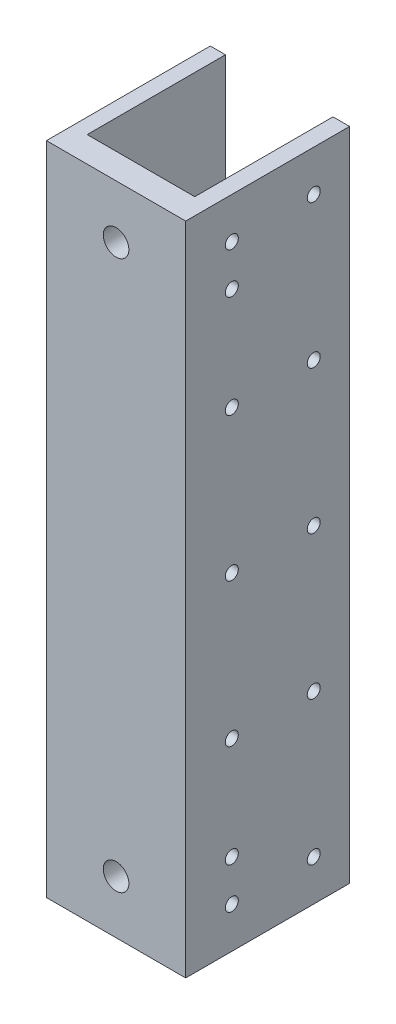
ISO-10303-21;
HEADER;
FILE_DESCRIPTION(('STEP AP214'),'2;1');
FILE_NAME('part.step','',(''),(''),'','','');
FILE_SCHEMA(('AUTOMOTIVE_DESIGN { 1 0 10303 214 1 1 1 1 }'));
ENDSEC;
DATA;
#1=APPLICATION_CONTEXT('core data for automotive mechanical design processes');
#2=APPLICATION_PROTOCOL_DEFINITION('international standard','automotive_design',2000,#1);
#3=PRODUCT_CONTEXT('',#1,'mechanical');
#4=PRODUCT('Part','Part','',(#3));
#5=PRODUCT_RELATED_PRODUCT_CATEGORY('part','',(#4));
#6=PRODUCT_DEFINITION_FORMATION('','',#4);
#7=PRODUCT_DEFINITION_CONTEXT('part definition',#1,'design');
#8=PRODUCT_DEFINITION('design','',#6,#7);
#9=PRODUCT_DEFINITION_SHAPE('','',#8);
#10=(LENGTH_UNIT() NAMED_UNIT(*) SI_UNIT(.MILLI.,.METRE.));
#11=(NAMED_UNIT(*) PLANE_ANGLE_UNIT() SI_UNIT($,.RADIAN.));
#12=(NAMED_UNIT(*) SI_UNIT($,.STERADIAN.) SOLID_ANGLE_UNIT());
#13=UNCERTAINTY_MEASURE_WITH_UNIT(LENGTH_MEASURE(1.E-05),#10,'distance_accuracy_value','');
#14=(GEOMETRIC_REPRESENTATION_CONTEXT(3) GLOBAL_UNCERTAINTY_ASSIGNED_CONTEXT((#13)) GLOBAL_UNIT_ASSIGNED_CONTEXT((#10,
#11,#12)) REPRESENTATION_CONTEXT('',''));
#15=CARTESIAN_POINT('',(0.,0.,0.));
#16=DIRECTION('',(0.,0.,1.));
#17=DIRECTION('',(1.,0.,0.));
#18=AXIS2_PLACEMENT_3D('',#15,#16,#17);
#19=CARTESIAN_POINT('',(0.,0.,0.));
#20=DIRECTION('',(0.,0.,-1.));
#21=DIRECTION('',(-1.,0.,0.));
#22=AXIS2_PLACEMENT_3D('',#19,#20,#21);
#23=PLANE('',#22);
#24=DIRECTION('',(1.,0.,0.));
#25=VECTOR('',#24,1.);
#26=CARTESIAN_POINT('',(-43.18,-78.2800336859192,0.));
#27=LINE('',#26,#25);
#28=CARTESIAN_POINT('',(-5.1435,-78.2800336859192,0.));
#29=VERTEX_POINT('',#28);
#30=CARTESIAN_POINT('',(0.,-78.2800336859192,0.));
#31=VERTEX_POINT('',#30);
#32=EDGE_CURVE('E202',#29,#31,#27,.T.);
#33=ORIENTED_EDGE('',*,*,#32,.F.);
#34=DIRECTION('',(0.,1.,0.));
#35=VECTOR('',#34,1.);
#36=CARTESIAN_POINT('',(-5.1435,0.,0.));
#37=LINE('',#36,#35);
#38=CARTESIAN_POINT('',(-5.1435,124.919966314081,0.));
#39=VERTEX_POINT('',#38);
#40=EDGE_CURVE('E152',#29,#39,#37,.T.);
#41=ORIENTED_EDGE('',*,*,#40,.T.);
#42=DIRECTION('',(-1.,0.,0.));
#43=VECTOR('',#42,1.);
#44=CARTESIAN_POINT('',(-43.18,124.919966314081,0.));
#45=LINE('',#44,#43);
#46=CARTESIAN_POINT('',(0.,124.919966314081,0.));
#47=VERTEX_POINT('',#46);
#48=EDGE_CURVE('E194',#47,#39,#45,.T.);
#49=ORIENTED_EDGE('',*,*,#48,.F.);
#50=DIRECTION('',(0.,1.,0.));
#51=VECTOR('',#50,1.);
#52=CARTESIAN_POINT('',(0.,-78.2800336859192,0.));
#53=LINE('',#52,#51);
#54=EDGE_CURVE('E204',#31,#47,#53,.T.);
#55=ORIENTED_EDGE('',*,*,#54,.F.);
#56=EDGE_LOOP('',(#33,#41,#49,#55));
#57=FACE_BOUND('',#56,.T.);
#58=ADVANCED_FACE('F35',(#57),#23,.T.);
#59=CARTESIAN_POINT('',(0.,-52.8800336859192,36.5125));
#60=DIRECTION('',(1.,0.,0.));
#61=DIRECTION('',(0.,0.,-1.));
#62=AXIS2_PLACEMENT_3D('',#59,#60,#61);
#63=CYLINDRICAL_SURFACE('',#62,2.01929999999999);
#64=CARTESIAN_POINT('',(0.,-52.8800336859192,36.5125));
#65=DIRECTION('',(1.,0.,0.));
#66=DIRECTION('',(0.,0.,-1.));
#67=AXIS2_PLACEMENT_3D('',#64,#65,#66);
#68=CIRCLE('',#67,2.01929999999999);
#69=CARTESIAN_POINT('',(0.,-52.8800336859192,34.4932));
#70=VERTEX_POINT('',#69);
#71=EDGE_CURVE('E179',#70,#70,#68,.T.);
#72=ORIENTED_EDGE('',*,*,#71,.T.);
#73=EDGE_LOOP('',(#72));
#74=FACE_BOUND('',#73,.T.);
#75=CARTESIAN_POINT('',(-5.1435,-52.8800336859192,36.5125));
#76=DIRECTION('',(-1.,0.,0.));
#77=DIRECTION('',(0.,0.,1.));
#78=AXIS2_PLACEMENT_3D('',#75,#76,#77);
#79=CIRCLE('',#78,2.01929999999999);
#80=CARTESIAN_POINT('',(-5.1435,-52.8800336859192,38.5318));
#81=VERTEX_POINT('',#80);
#82=EDGE_CURVE('E149',#81,#81,#79,.F.);
#83=ORIENTED_EDGE('',*,*,#82,.F.);
#84=EDGE_LOOP('',(#83));
#85=FACE_BOUND('',#84,.T.);
#86=ADVANCED_FACE('F292',(#74,#85),#63,.F.);
#87=CARTESIAN_POINT('',(0.,23.3199663140808,36.5125));
#88=DIRECTION('',(1.,0.,0.));
#89=DIRECTION('',(0.,0.,-1.));
#90=AXIS2_PLACEMENT_3D('',#87,#88,#89);
#91=CYLINDRICAL_SURFACE('',#90,2.01929999999999);
#92=CARTESIAN_POINT('',(0.,23.3199663140808,36.5125));
#93=DIRECTION('',(1.,0.,0.));
#94=DIRECTION('',(0.,0.,-1.));
#95=AXIS2_PLACEMENT_3D('',#92,#93,#94);
#96=CIRCLE('',#95,2.01929999999999);
#97=CARTESIAN_POINT('',(0.,23.3199663140808,34.4932));
#98=VERTEX_POINT('',#97);
#99=EDGE_CURVE('E173',#98,#98,#96,.T.);
#100=ORIENTED_EDGE('',*,*,#99,.T.);
#101=EDGE_LOOP('',(#100));
#102=FACE_BOUND('',#101,.T.);
#103=CARTESIAN_POINT('',(-5.1435,23.3199663140808,36.5125));
#104=DIRECTION('',(-1.,0.,0.));
#105=DIRECTION('',(0.,0.,1.));
#106=AXIS2_PLACEMENT_3D('',#103,#104,#105);
#107=CIRCLE('',#106,2.01929999999999);
#108=CARTESIAN_POINT('',(-5.1435,23.3199663140808,38.5318));
#109=VERTEX_POINT('',#108);
#110=EDGE_CURVE('E146',#109,#109,#107,.F.);
#111=ORIENTED_EDGE('',*,*,#110,.F.);
#112=EDGE_LOOP('',(#111));
#113=FACE_BOUND('',#112,.T.);
#114=ADVANCED_FACE('F299',(#102,#113),#91,.F.);
#115=CARTESIAN_POINT('',(0.,99.5199663140808,36.5125));
#116=DIRECTION('',(1.,0.,0.));
#117=DIRECTION('',(0.,0.,-1.));
#118=AXIS2_PLACEMENT_3D('',#115,#116,#117);
#119=CYLINDRICAL_SURFACE('',#118,2.01929999999999);
#120=CARTESIAN_POINT('',(0.,99.5199663140808,36.5125));
#121=DIRECTION('',(1.,0.,0.));
#122=DIRECTION('',(0.,0.,-1.));
#123=AXIS2_PLACEMENT_3D('',#120,#121,#122);
#124=CIRCLE('',#123,2.0193);
#125=CARTESIAN_POINT('',(0.,99.5199663140808,34.4932));
#126=VERTEX_POINT('',#125);
#127=EDGE_CURVE('E167',#126,#126,#124,.T.);
#128=ORIENTED_EDGE('',*,*,#127,.T.);
#129=EDGE_LOOP('',(#128));
#130=FACE_BOUND('',#129,.T.);
#131=CARTESIAN_POINT('',(-5.1435,99.5199663140808,36.5125));
#132=DIRECTION('',(-1.,0.,0.));
#133=DIRECTION('',(0.,0.,1.));
#134=AXIS2_PLACEMENT_3D('',#131,#132,#133);
#135=CIRCLE('',#134,2.01929999999999);
#136=CARTESIAN_POINT('',(-5.1435,99.5199663140808,38.5318));
#137=VERTEX_POINT('',#136);
#138=EDGE_CURVE('E144',#137,#137,#135,.F.);
#139=ORIENTED_EDGE('',*,*,#138,.F.);
#140=EDGE_LOOP('',(#139));
#141=FACE_BOUND('',#140,.T.);
#142=ADVANCED_FACE('F330',(#130,#141),#119,.F.);
#143=CARTESIAN_POINT('',(-43.18,-78.2800336859192,50.8));
#144=DIRECTION('',(1.,0.,0.));
#145=DIRECTION('',(0.,0.,-1.));
#146=AXIS2_PLACEMENT_3D('',#143,#144,#145);
#147=PLANE('',#146);
#148=CARTESIAN_POINT('',(-43.18,99.5199663140808,36.5125));
#149=DIRECTION('',(1.,0.,0.));
#150=DIRECTION('',(0.,0.,-1.));
#151=AXIS2_PLACEMENT_3D('',#148,#149,#150);
#152=CIRCLE('',#151,2.01929999999999);
#153=CARTESIAN_POINT('',(-43.18,99.5199663140808,34.4932));
#154=VERTEX_POINT('',#153);
#155=EDGE_CURVE('E170',#154,#154,#152,.T.);
#156=ORIENTED_EDGE('',*,*,#155,.T.);
#157=EDGE_LOOP('',(#156));
#158=FACE_BOUND('',#157,.T.);
#159=CARTESIAN_POINT('',(-43.18,23.3199663140808,36.5125));
#160=DIRECTION('',(1.,0.,0.));
#161=DIRECTION('',(0.,0.,-1.));
#162=AXIS2_PLACEMENT_3D('',#159,#160,#161);
#163=CIRCLE('',#162,2.01929999999999);
#164=CARTESIAN_POINT('',(-43.18,23.3199663140808,34.4932));
#165=VERTEX_POINT('',#164);
#166=EDGE_CURVE('E176',#165,#165,#163,.T.);
#167=ORIENTED_EDGE('',*,*,#166,.T.);
#168=EDGE_LOOP('',(#167));
#169=FACE_BOUND('',#168,.T.);
#170=CARTESIAN_POINT('',(-43.18,-52.8800336859192,36.5125));
#171=DIRECTION('',(1.,0.,0.));
#172=DIRECTION('',(0.,0.,-1.));
#173=AXIS2_PLACEMENT_3D('',#170,#171,#172);
#174=CIRCLE('',#173,2.01929999999999);
#175=CARTESIAN_POINT('',(-43.18,-52.8800336859192,34.4932));
#176=VERTEX_POINT('',#175);
#177=EDGE_CURVE('E182',#176,#176,#174,.T.);
#178=ORIENTED_EDGE('',*,*,#177,.T.);
#179=EDGE_LOOP('',(#178));
#180=FACE_BOUND('',#179,.T.);
#181=DIRECTION('',(0.,-1.,0.));
#182=VECTOR('',#181,1.);
#183=CARTESIAN_POINT('',(-43.18,-78.2800336859192,0.));
#184=LINE('',#183,#182);
#185=CARTESIAN_POINT('',(-43.18,124.919966314081,0.));
#186=VERTEX_POINT('',#185);
#187=CARTESIAN_POINT('',(-43.18,-78.2800336859192,0.));
#188=VERTEX_POINT('',#187);
#189=EDGE_CURVE('E191',#186,#188,#184,.T.);
#190=ORIENTED_EDGE('',*,*,#189,.T.);
#191=DIRECTION('',(0.,0.,-1.));
#192=VECTOR('',#191,1.);
#193=CARTESIAN_POINT('',(-43.18,-78.2800336859192,50.8));
#194=LINE('',#193,#192);
#195=CARTESIAN_POINT('',(-43.18,-78.2800336859192,50.8));
#196=VERTEX_POINT('',#195);
#197=EDGE_CURVE('E11',#196,#188,#194,.T.);
#198=ORIENTED_EDGE('',*,*,#197,.F.);
#199=DIRECTION('',(0.,-1.,0.));
#200=VECTOR('',#199,1.);
#201=CARTESIAN_POINT('',(-43.18,-78.2800336859192,50.8));
#202=LINE('',#201,#200);
#203=CARTESIAN_POINT('',(-43.18,124.919966314081,50.8));
#204=VERTEX_POINT('',#203);
#205=EDGE_CURVE('E192',#204,#196,#202,.T.);
#206=ORIENTED_EDGE('',*,*,#205,.F.);
#207=DIRECTION('',(0.,0.,-1.));
#208=VECTOR('',#207,1.);
#209=CARTESIAN_POINT('',(-43.18,124.919966314081,50.8));
#210=LINE('',#209,#208);
#211=EDGE_CURVE('E199',#204,#186,#210,.T.);
#212=ORIENTED_EDGE('',*,*,#211,.T.);
#213=EDGE_LOOP('',(#190,#198,#206,#212));
#214=FACE_BOUND('',#213,.T.);
#215=ADVANCED_FACE('F37',(#158,#169,#180,#214),#147,.F.);
#216=CARTESIAN_POINT('',(-43.18,-78.2800336859192,50.8));
#217=DIRECTION('',(0.,1.,0.));
#218=DIRECTION('',(0.,0.,1.));
#219=AXIS2_PLACEMENT_3D('',#216,#217,#218);
#220=PLANE('',#219);
#221=CARTESIAN_POINT('',(-38.481,-78.2800336859192,0.));
#222=VERTEX_POINT('',#221);
#223=EDGE_CURVE('E133',#188,#222,#27,.T.);
#224=ORIENTED_EDGE('',*,*,#223,.T.);
#225=DIRECTION('',(0.,0.,1.));
#226=VECTOR('',#225,1.);
#227=CARTESIAN_POINT('',(-38.481,-78.2800336859192,-7.73428244373345));
#228=LINE('',#227,#226);
#229=CARTESIAN_POINT('',(-38.481,-78.2800336859192,42.8625));
#230=VERTEX_POINT('',#229);
#231=EDGE_CURVE('E115',#222,#230,#228,.T.);
#232=ORIENTED_EDGE('',*,*,#231,.T.);
#233=DIRECTION('',(1.,0.,0.));
#234=VECTOR('',#233,1.);
#235=CARTESIAN_POINT('',(-38.481,-78.2800336859192,42.8625));
#236=LINE('',#235,#234);
#237=CARTESIAN_POINT('',(-5.1435,-78.2800336859192,42.8625));
#238=VERTEX_POINT('',#237);
#239=EDGE_CURVE('E126',#230,#238,#236,.T.);
#240=ORIENTED_EDGE('',*,*,#239,.T.);
#241=DIRECTION('',(0.,0.,1.));
#242=VECTOR('',#241,1.);
#243=CARTESIAN_POINT('',(-5.1435,-78.2800336859192,-7.73428244373345));
#244=LINE('',#243,#242);
#245=EDGE_CURVE('E122',#29,#238,#244,.T.);
#246=ORIENTED_EDGE('',*,*,#245,.F.);
#247=ORIENTED_EDGE('',*,*,#32,.T.);
#248=DIRECTION('',(0.,0.,-1.));
#249=VECTOR('',#248,1.);
#250=CARTESIAN_POINT('',(0.,-78.2800336859192,50.8));
#251=LINE('',#250,#249);
#252=CARTESIAN_POINT('',(0.,-78.2800336859192,50.8));
#253=VERTEX_POINT('',#252);
#254=EDGE_CURVE('E44',#253,#31,#251,.T.);
#255=ORIENTED_EDGE('',*,*,#254,.F.);
#256=DIRECTION('',(1.,0.,0.));
#257=VECTOR('',#256,1.);
#258=CARTESIAN_POINT('',(-43.18,-78.2800336859192,50.8));
#259=LINE('',#258,#257);
#260=EDGE_CURVE('E89',#196,#253,#259,.T.);
#261=ORIENTED_EDGE('',*,*,#260,.F.);
#262=ORIENTED_EDGE('',*,*,#197,.T.);
#263=EDGE_LOOP('',(#224,#232,#240,#246,#247,#255,#261,#262));
#264=FACE_BOUND('',#263,.T.);
#265=ADVANCED_FACE('F132',(#264),#220,.F.);
#266=CARTESIAN_POINT('',(0.,-78.2800336859192,50.8));
#267=DIRECTION('',(-1.,0.,0.));
#268=DIRECTION('',(0.,0.,1.));
#269=AXIS2_PLACEMENT_3D('',#266,#267,#268);
#270=PLANE('',#269);
#271=CARTESIAN_POINT('',(0.,112.219966314081,11.1125000000004));
#272=DIRECTION('',(-1.,0.,0.));
#273=DIRECTION('',(0.,0.,1.));
#274=AXIS2_PLACEMENT_3D('',#271,#272,#273);
#275=CIRCLE('',#274,2.01929999999999);
#276=CARTESIAN_POINT('',(0.,112.219966314081,13.1318000000004));
#277=VERTEX_POINT('',#276);
#278=EDGE_CURVE('E249',#277,#277,#275,.T.);
#279=ORIENTED_EDGE('',*,*,#278,.T.);
#280=EDGE_LOOP('',(#279));
#281=FACE_BOUND('',#280,.T.);
#282=CARTESIAN_POINT('',(0.,112.219966314081,36.5125000000004));
#283=DIRECTION('',(-1.,0.,0.));
#284=DIRECTION('',(0.,0.,1.));
#285=AXIS2_PLACEMENT_3D('',#282,#283,#284);
#286=CIRCLE('',#285,2.01929999999999);
#287=CARTESIAN_POINT('',(0.,112.219966314081,38.5318000000004));
#288=VERTEX_POINT('',#287);
#289=EDGE_CURVE('E246',#288,#288,#286,.T.);
#290=ORIENTED_EDGE('',*,*,#289,.T.);
#291=EDGE_LOOP('',(#290));
#292=FACE_BOUND('',#291,.T.);
#293=CARTESIAN_POINT('',(0.,67.7699663140806,11.1125000000005));
#294=DIRECTION('',(-1.,0.,0.));
#295=DIRECTION('',(0.,0.,1.));
#296=AXIS2_PLACEMENT_3D('',#293,#294,#295);
#297=CIRCLE('',#296,2.01929999999999);
#298=CARTESIAN_POINT('',(0.,67.7699663140806,13.1318000000005));
#299=VERTEX_POINT('',#298);
#300=EDGE_CURVE('E243',#299,#299,#297,.T.);
#301=ORIENTED_EDGE('',*,*,#300,.T.);
#302=EDGE_LOOP('',(#301));
#303=FACE_BOUND('',#302,.T.);
#304=CARTESIAN_POINT('',(0.,67.7699663140808,36.5125000000006));
#305=DIRECTION('',(-1.,0.,0.));
#306=DIRECTION('',(0.,0.,1.));
#307=AXIS2_PLACEMENT_3D('',#304,#305,#306);
#308=CIRCLE('',#307,2.01929999999999);
#309=CARTESIAN_POINT('',(0.,67.7699663140808,38.5318000000006));
#310=VERTEX_POINT('',#309);
#311=EDGE_CURVE('E239',#310,#310,#308,.T.);
#312=ORIENTED_EDGE('',*,*,#311,.T.);
#313=EDGE_LOOP('',(#312));
#314=FACE_BOUND('',#313,.T.);
#315=CARTESIAN_POINT('',(0.,23.3199663140806,11.1125000000007));
#316=DIRECTION('',(-1.,0.,0.));
#317=DIRECTION('',(0.,0.,1.));
#318=AXIS2_PLACEMENT_3D('',#315,#316,#317);
#319=CIRCLE('',#318,2.01929999999999);
#320=CARTESIAN_POINT('',(0.,23.3199663140806,13.1318000000007));
#321=VERTEX_POINT('',#320);
#322=EDGE_CURVE('E235',#321,#321,#319,.T.);
#323=ORIENTED_EDGE('',*,*,#322,.T.);
#324=EDGE_LOOP('',(#323));
#325=FACE_BOUND('',#324,.T.);
#326=CARTESIAN_POINT('',(0.,-21.1300336859194,11.1125000000009));
#327=DIRECTION('',(-1.,0.,0.));
#328=DIRECTION('',(0.,0.,1.));
#329=AXIS2_PLACEMENT_3D('',#326,#327,#328);
#330=CIRCLE('',#329,2.01929999999999);
#331=CARTESIAN_POINT('',(0.,-21.1300336859194,13.1318000000009));
#332=VERTEX_POINT('',#331);
#333=EDGE_CURVE('E231',#332,#332,#330,.T.);
#334=ORIENTED_EDGE('',*,*,#333,.T.);
#335=EDGE_LOOP('',(#334));
#336=FACE_BOUND('',#335,.T.);
#337=CARTESIAN_POINT('',(0.,-21.1300336859192,36.5125000000009));
#338=DIRECTION('',(-1.,0.,0.));
#339=DIRECTION('',(0.,0.,1.));
#340=AXIS2_PLACEMENT_3D('',#337,#338,#339);
#341=CIRCLE('',#340,2.01929999999999);
#342=CARTESIAN_POINT('',(0.,-21.1300336859192,38.5318000000008));
#343=VERTEX_POINT('',#342);
#344=EDGE_CURVE('E227',#343,#343,#341,.T.);
#345=ORIENTED_EDGE('',*,*,#344,.T.);
#346=EDGE_LOOP('',(#345));
#347=FACE_BOUND('',#346,.T.);
#348=CARTESIAN_POINT('',(0.,-65.5800336859192,36.512500000001));
#349=DIRECTION('',(-1.,0.,0.));
#350=DIRECTION('',(0.,0.,1.));
#351=AXIS2_PLACEMENT_3D('',#348,#349,#350);
#352=CIRCLE('',#351,2.01929999999999);
#353=CARTESIAN_POINT('',(0.,-65.5800336859192,38.531800000001));
#354=VERTEX_POINT('',#353);
#355=EDGE_CURVE('E223',#354,#354,#352,.T.);
#356=ORIENTED_EDGE('',*,*,#355,.T.);
#357=EDGE_LOOP('',(#356));
#358=FACE_BOUND('',#357,.T.);
#359=CARTESIAN_POINT('',(0.,-65.5800336859194,11.112500000001));
#360=DIRECTION('',(-1.,0.,0.));
#361=DIRECTION('',(0.,0.,1.));
#362=AXIS2_PLACEMENT_3D('',#359,#360,#361);
#363=CIRCLE('',#362,2.01929999999999);
#364=CARTESIAN_POINT('',(0.,-65.5800336859194,13.131800000001));
#365=VERTEX_POINT('',#364);
#366=EDGE_CURVE('E138',#365,#365,#363,.T.);
#367=ORIENTED_EDGE('',*,*,#366,.T.);
#368=EDGE_LOOP('',(#367));
#369=FACE_BOUND('',#368,.T.);
#370=ORIENTED_EDGE('',*,*,#127,.F.);
#371=EDGE_LOOP('',(#370));
#372=FACE_BOUND('',#371,.T.);
#373=ORIENTED_EDGE('',*,*,#99,.F.);
#374=EDGE_LOOP('',(#373));
#375=FACE_BOUND('',#374,.T.);
#376=ORIENTED_EDGE('',*,*,#71,.F.);
#377=EDGE_LOOP('',(#376));
#378=FACE_BOUND('',#377,.T.);
#379=ORIENTED_EDGE('',*,*,#54,.T.);
#380=DIRECTION('',(0.,0.,-1.));
#381=VECTOR('',#380,1.);
#382=CARTESIAN_POINT('',(0.,124.919966314081,50.8));
#383=LINE('',#382,#381);
#384=CARTESIAN_POINT('',(0.,124.919966314081,50.8));
#385=VERTEX_POINT('',#384);
#386=EDGE_CURVE('E209',#385,#47,#383,.T.);
#387=ORIENTED_EDGE('',*,*,#386,.F.);
#388=DIRECTION('',(0.,1.,0.));
#389=VECTOR('',#388,1.);
#390=CARTESIAN_POINT('',(0.,-78.2800336859192,50.8));
#391=LINE('',#390,#389);
#392=EDGE_CURVE('E196',#253,#385,#391,.T.);
#393=ORIENTED_EDGE('',*,*,#392,.F.);
#394=ORIENTED_EDGE('',*,*,#254,.T.);
#395=EDGE_LOOP('',(#379,#387,#393,#394));
#396=FACE_BOUND('',#395,.T.);
#397=ADVANCED_FACE('F272',(#281,#292,#303,#314,#325,#336,#347,#358,#369,#372,#375,#378,#396),
#270,.F.);
#398=CARTESIAN_POINT('',(-43.18,124.919966314081,50.8));
#399=DIRECTION('',(0.,-1.,0.));
#400=DIRECTION('',(0.,0.,-1.));
#401=AXIS2_PLACEMENT_3D('',#398,#399,#400);
#402=PLANE('',#401);
#403=DIRECTION('',(1.,0.,0.));
#404=VECTOR('',#403,1.);
#405=CARTESIAN_POINT('',(-38.481,124.919966314081,42.8625));
#406=LINE('',#405,#404);
#407=CARTESIAN_POINT('',(-38.481,124.919966314081,42.8625));
#408=VERTEX_POINT('',#407);
#409=CARTESIAN_POINT('',(-5.1435,124.919966314081,42.8625));
#410=VERTEX_POINT('',#409);
#411=EDGE_CURVE('E135',#408,#410,#406,.T.);
#412=ORIENTED_EDGE('',*,*,#411,.F.);
#413=DIRECTION('',(0.,0.,1.));
#414=VECTOR('',#413,1.);
#415=CARTESIAN_POINT('',(-38.481,124.919966314081,-7.73428244373345));
#416=LINE('',#415,#414);
#417=CARTESIAN_POINT('',(-38.481,124.919966314081,0.));
#418=VERTEX_POINT('',#417);
#419=EDGE_CURVE('E117',#418,#408,#416,.T.);
#420=ORIENTED_EDGE('',*,*,#419,.F.);
#421=EDGE_CURVE('E82',#418,#186,#45,.T.);
#422=ORIENTED_EDGE('',*,*,#421,.T.);
#423=ORIENTED_EDGE('',*,*,#211,.F.);
#424=DIRECTION('',(-1.,0.,0.));
#425=VECTOR('',#424,1.);
#426=CARTESIAN_POINT('',(-43.18,124.919966314081,50.8));
#427=LINE('',#426,#425);
#428=EDGE_CURVE('E61',#385,#204,#427,.T.);
#429=ORIENTED_EDGE('',*,*,#428,.F.);
#430=ORIENTED_EDGE('',*,*,#386,.T.);
#431=ORIENTED_EDGE('',*,*,#48,.T.);
#432=DIRECTION('',(0.,0.,1.));
#433=VECTOR('',#432,1.);
#434=CARTESIAN_POINT('',(-5.1435,124.919966314081,-7.73428244373345));
#435=LINE('',#434,#433);
#436=EDGE_CURVE('E52',#39,#410,#435,.T.);
#437=ORIENTED_EDGE('',*,*,#436,.T.);
#438=EDGE_LOOP('',(#412,#420,#422,#423,#429,#430,#431,#437));
#439=FACE_BOUND('',#438,.T.);
#440=ADVANCED_FACE('F317',(#439),#402,.F.);
#441=CARTESIAN_POINT('',(0.,0.,50.8));
#442=DIRECTION('',(0.,0.,-1.));
#443=DIRECTION('',(-1.,0.,0.));
#444=AXIS2_PLACEMENT_3D('',#441,#442,#443);
#445=PLANE('',#444);
#446=CARTESIAN_POINT('',(-21.59,108.409966314081,50.8));
#447=DIRECTION('',(0.,0.,1.));
#448=DIRECTION('',(1.,0.,0.));
#449=AXIS2_PLACEMENT_3D('',#446,#447,#448);
#450=CIRCLE('',#449,3.96874999999999);
#451=CARTESIAN_POINT('',(-17.62125,108.409966314081,50.8));
#452=VERTEX_POINT('',#451);
#453=EDGE_CURVE('E185',#452,#452,#450,.T.);
#454=ORIENTED_EDGE('',*,*,#453,.F.);
#455=EDGE_LOOP('',(#454));
#456=FACE_BOUND('',#455,.T.);
#457=CARTESIAN_POINT('',(-21.59,-61.7700336859192,50.8));
#458=DIRECTION('',(0.,0.,1.));
#459=DIRECTION('',(1.,0.,0.));
#460=AXIS2_PLACEMENT_3D('',#457,#458,#459);
#461=CIRCLE('',#460,3.96874999999999);
#462=CARTESIAN_POINT('',(-17.62125,-61.7700336859192,50.8));
#463=VERTEX_POINT('',#462);
#464=EDGE_CURVE('E188',#463,#463,#461,.T.);
#465=ORIENTED_EDGE('',*,*,#464,.F.);
#466=EDGE_LOOP('',(#465));
#467=FACE_BOUND('',#466,.T.);
#468=ORIENTED_EDGE('',*,*,#205,.T.);
#469=ORIENTED_EDGE('',*,*,#260,.T.);
#470=ORIENTED_EDGE('',*,*,#392,.T.);
#471=ORIENTED_EDGE('',*,*,#428,.T.);
#472=EDGE_LOOP('',(#468,#469,#470,#471));
#473=FACE_BOUND('',#472,.T.);
#474=ADVANCED_FACE('F308',(#456,#467,#473),#445,.F.);
#475=DIRECTION('',(0.,1.,0.));
#476=VECTOR('',#475,1.);
#477=CARTESIAN_POINT('',(-38.481,0.,0.));
#478=LINE('',#477,#476);
#479=EDGE_CURVE('E161',#222,#418,#478,.T.);
#480=ORIENTED_EDGE('',*,*,#479,.F.);
#481=ORIENTED_EDGE('',*,*,#223,.F.);
#482=ORIENTED_EDGE('',*,*,#189,.F.);
#483=ORIENTED_EDGE('',*,*,#421,.F.);
#484=EDGE_LOOP('',(#480,#481,#482,#483));
#485=FACE_BOUND('',#484,.T.);
#486=ADVANCED_FACE('F295',(#485),#23,.T.);
#487=CARTESIAN_POINT('',(-21.59,-61.7700336859192,50.8));
#488=DIRECTION('',(0.,0.,1.));
#489=DIRECTION('',(1.,0.,0.));
#490=AXIS2_PLACEMENT_3D('',#487,#488,#489);
#491=CYLINDRICAL_SURFACE('',#490,3.96874999999999);
#492=CARTESIAN_POINT('',(-21.59,-61.7700336859192,42.8625));
#493=DIRECTION('',(0.,0.,1.));
#494=DIRECTION('',(1.,0.,0.));
#495=AXIS2_PLACEMENT_3D('',#492,#493,#494);
#496=CIRCLE('',#495,3.96874999999999);
#497=CARTESIAN_POINT('',(-17.62125,-61.7700336859192,42.8625));
#498=VERTEX_POINT('',#497);
#499=EDGE_CURVE('E164',#498,#498,#496,.F.);
#500=ORIENTED_EDGE('',*,*,#499,.T.);
#501=EDGE_LOOP('',(#500));
#502=FACE_BOUND('',#501,.T.);
#503=ORIENTED_EDGE('',*,*,#464,.T.);
#504=EDGE_LOOP('',(#503));
#505=FACE_BOUND('',#504,.T.);
#506=ADVANCED_FACE('F307',(#502,#505),#491,.F.);
#507=CARTESIAN_POINT('',(-21.59,108.409966314081,50.8));
#508=DIRECTION('',(0.,0.,1.));
#509=DIRECTION('',(1.,0.,0.));
#510=AXIS2_PLACEMENT_3D('',#507,#508,#509);
#511=CYLINDRICAL_SURFACE('',#510,3.96874999999999);
#512=CARTESIAN_POINT('',(-21.59,108.409966314081,42.8625));
#513=DIRECTION('',(0.,0.,1.));
#514=DIRECTION('',(1.,0.,0.));
#515=AXIS2_PLACEMENT_3D('',#512,#513,#514);
#516=CIRCLE('',#515,3.96874999999999);
#517=CARTESIAN_POINT('',(-17.62125,108.409966314081,42.8625));
#518=VERTEX_POINT('',#517);
#519=EDGE_CURVE('E163',#518,#518,#516,.F.);
#520=ORIENTED_EDGE('',*,*,#519,.T.);
#521=EDGE_LOOP('',(#520));
#522=FACE_BOUND('',#521,.T.);
#523=ORIENTED_EDGE('',*,*,#453,.T.);
#524=EDGE_LOOP('',(#523));
#525=FACE_BOUND('',#524,.T.);
#526=ADVANCED_FACE('F314',(#522,#525),#511,.F.);
#527=CARTESIAN_POINT('',(-38.481,-52.8800336859192,36.5125));
#528=DIRECTION('',(-1.,0.,0.));
#529=DIRECTION('',(0.,0.,1.));
#530=AXIS2_PLACEMENT_3D('',#527,#528,#529);
#531=CIRCLE('',#530,2.01929999999999);
#532=CARTESIAN_POINT('',(-38.481,-52.8800336859192,38.5318));
#533=VERTEX_POINT('',#532);
#534=EDGE_CURVE('E158',#533,#533,#531,.F.);
#535=ORIENTED_EDGE('',*,*,#534,.T.);
#536=EDGE_LOOP('',(#535));
#537=FACE_BOUND('',#536,.T.);
#538=ORIENTED_EDGE('',*,*,#177,.F.);
#539=EDGE_LOOP('',(#538));
#540=FACE_BOUND('',#539,.T.);
#541=ADVANCED_FACE('F302',(#537,#540),#63,.F.);
#542=CARTESIAN_POINT('',(-38.481,23.3199663140808,36.5125));
#543=DIRECTION('',(-1.,0.,0.));
#544=DIRECTION('',(0.,0.,1.));
#545=AXIS2_PLACEMENT_3D('',#542,#543,#544);
#546=CIRCLE('',#545,2.01929999999999);
#547=CARTESIAN_POINT('',(-38.481,23.3199663140808,38.5318));
#548=VERTEX_POINT('',#547);
#549=EDGE_CURVE('E155',#548,#548,#546,.F.);
#550=ORIENTED_EDGE('',*,*,#549,.T.);
#551=EDGE_LOOP('',(#550));
#552=FACE_BOUND('',#551,.T.);
#553=ORIENTED_EDGE('',*,*,#166,.F.);
#554=EDGE_LOOP('',(#553));
#555=FACE_BOUND('',#554,.T.);
#556=ADVANCED_FACE('F346',(#552,#555),#91,.F.);
#557=CARTESIAN_POINT('',(-38.481,99.5199663140808,36.5125));
#558=DIRECTION('',(-1.,0.,0.));
#559=DIRECTION('',(0.,0.,1.));
#560=AXIS2_PLACEMENT_3D('',#557,#558,#559);
#561=CIRCLE('',#560,2.01929999999999);
#562=CARTESIAN_POINT('',(-38.481,99.5199663140808,38.5318));
#563=VERTEX_POINT('',#562);
#564=EDGE_CURVE('E154',#563,#563,#561,.F.);
#565=ORIENTED_EDGE('',*,*,#564,.T.);
#566=EDGE_LOOP('',(#565));
#567=FACE_BOUND('',#566,.T.);
#568=ORIENTED_EDGE('',*,*,#155,.F.);
#569=EDGE_LOOP('',(#568));
#570=FACE_BOUND('',#569,.T.);
#571=ADVANCED_FACE('F338',(#567,#570),#119,.F.);
#572=CARTESIAN_POINT('',(-38.481,-78.2800336859192,42.8625));
#573=DIRECTION('',(0.,0.,1.));
#574=DIRECTION('',(1.,0.,0.));
#575=AXIS2_PLACEMENT_3D('',#572,#573,#574);
#576=PLANE('',#575);
#577=ORIENTED_EDGE('',*,*,#519,.F.);
#578=EDGE_LOOP('',(#577));
#579=FACE_BOUND('',#578,.T.);
#580=ORIENTED_EDGE('',*,*,#411,.T.);
#581=DIRECTION('',(0.,1.,0.));
#582=VECTOR('',#581,1.);
#583=CARTESIAN_POINT('',(-5.1435,-78.2800336859192,42.8625));
#584=LINE('',#583,#582);
#585=EDGE_CURVE('E121',#238,#410,#584,.T.);
#586=ORIENTED_EDGE('',*,*,#585,.F.);
#587=ORIENTED_EDGE('',*,*,#239,.F.);
#588=DIRECTION('',(0.,1.,0.));
#589=VECTOR('',#588,1.);
#590=CARTESIAN_POINT('',(-38.481,-78.2800336859192,42.8625));
#591=LINE('',#590,#589);
#592=EDGE_CURVE('E110',#230,#408,#591,.T.);
#593=ORIENTED_EDGE('',*,*,#592,.T.);
#594=EDGE_LOOP('',(#580,#586,#587,#593));
#595=FACE_BOUND('',#594,.T.);
#596=ORIENTED_EDGE('',*,*,#499,.F.);
#597=EDGE_LOOP('',(#596));
#598=FACE_BOUND('',#597,.T.);
#599=ADVANCED_FACE('F127',(#579,#595,#598),#576,.F.);
#600=CARTESIAN_POINT('',(-38.481,-78.2800336859192,-7.73428244373345));
#601=DIRECTION('',(-1.,0.,0.));
#602=DIRECTION('',(0.,0.,1.));
#603=AXIS2_PLACEMENT_3D('',#600,#601,#602);
#604=PLANE('',#603);
#605=ORIENTED_EDGE('',*,*,#479,.T.);
#606=ORIENTED_EDGE('',*,*,#419,.T.);
#607=ORIENTED_EDGE('',*,*,#592,.F.);
#608=ORIENTED_EDGE('',*,*,#231,.F.);
#609=EDGE_LOOP('',(#605,#606,#607,#608));
#610=FACE_BOUND('',#609,.T.);
#611=ORIENTED_EDGE('',*,*,#549,.F.);
#612=EDGE_LOOP('',(#611));
#613=FACE_BOUND('',#612,.T.);
#614=ORIENTED_EDGE('',*,*,#564,.F.);
#615=EDGE_LOOP('',(#614));
#616=FACE_BOUND('',#615,.T.);
#617=ORIENTED_EDGE('',*,*,#534,.F.);
#618=EDGE_LOOP('',(#617));
#619=FACE_BOUND('',#618,.T.);
#620=ADVANCED_FACE('F112',(#610,#613,#616,#619),#604,.F.);
#621=CARTESIAN_POINT('',(-5.1435,-78.2800336859192,-7.73428244373345));
#622=DIRECTION('',(-1.,0.,0.));
#623=DIRECTION('',(0.,0.,1.));
#624=AXIS2_PLACEMENT_3D('',#621,#622,#623);
#625=PLANE('',#624);
#626=CARTESIAN_POINT('',(-5.1435,112.219966314081,11.1125000000004));
#627=DIRECTION('',(-1.,0.,0.));
#628=DIRECTION('',(0.,0.,1.));
#629=AXIS2_PLACEMENT_3D('',#626,#627,#628);
#630=CIRCLE('',#629,2.01929999999999);
#631=CARTESIAN_POINT('',(-5.1435,112.219966314081,13.1318000000004));
#632=VERTEX_POINT('',#631);
#633=EDGE_CURVE('E39',#632,#632,#630,.T.);
#634=ORIENTED_EDGE('',*,*,#633,.F.);
#635=EDGE_LOOP('',(#634));
#636=FACE_BOUND('',#635,.T.);
#637=CARTESIAN_POINT('',(-5.1435,112.219966314081,36.5125000000004));
#638=DIRECTION('',(-1.,0.,0.));
#639=DIRECTION('',(0.,0.,1.));
#640=AXIS2_PLACEMENT_3D('',#637,#638,#639);
#641=CIRCLE('',#640,2.01929999999999);
#642=CARTESIAN_POINT('',(-5.1435,112.219966314081,38.5318000000004));
#643=VERTEX_POINT('',#642);
#644=EDGE_CURVE('E247',#643,#643,#641,.T.);
#645=ORIENTED_EDGE('',*,*,#644,.F.);
#646=EDGE_LOOP('',(#645));
#647=FACE_BOUND('',#646,.T.);
#648=CARTESIAN_POINT('',(-5.1435,67.7699663140806,11.1125000000005));
#649=DIRECTION('',(-1.,0.,0.));
#650=DIRECTION('',(0.,0.,1.));
#651=AXIS2_PLACEMENT_3D('',#648,#649,#650);
#652=CIRCLE('',#651,2.01929999999999);
#653=CARTESIAN_POINT('',(-5.1435,67.7699663140806,13.1318000000005));
#654=VERTEX_POINT('',#653);
#655=EDGE_CURVE('E244',#654,#654,#652,.T.);
#656=ORIENTED_EDGE('',*,*,#655,.F.);
#657=EDGE_LOOP('',(#656));
#658=FACE_BOUND('',#657,.T.);
#659=CARTESIAN_POINT('',(-5.1435,67.7699663140808,36.5125000000006));
#660=DIRECTION('',(-1.,0.,0.));
#661=DIRECTION('',(0.,0.,1.));
#662=AXIS2_PLACEMENT_3D('',#659,#660,#661);
#663=CIRCLE('',#662,2.01929999999999);
#664=CARTESIAN_POINT('',(-5.1435,67.7699663140808,38.5318000000006));
#665=VERTEX_POINT('',#664);
#666=EDGE_CURVE('E240',#665,#665,#663,.T.);
#667=ORIENTED_EDGE('',*,*,#666,.F.);
#668=EDGE_LOOP('',(#667));
#669=FACE_BOUND('',#668,.T.);
#670=CARTESIAN_POINT('',(-5.1435,23.3199663140806,11.1125000000007));
#671=DIRECTION('',(-1.,0.,0.));
#672=DIRECTION('',(0.,0.,1.));
#673=AXIS2_PLACEMENT_3D('',#670,#671,#672);
#674=CIRCLE('',#673,2.01929999999999);
#675=CARTESIAN_POINT('',(-5.1435,23.3199663140806,13.1318000000007));
#676=VERTEX_POINT('',#675);
#677=EDGE_CURVE('E236',#676,#676,#674,.T.);
#678=ORIENTED_EDGE('',*,*,#677,.F.);
#679=EDGE_LOOP('',(#678));
#680=FACE_BOUND('',#679,.T.);
#681=CARTESIAN_POINT('',(-5.1435,-21.1300336859194,11.1125000000009));
#682=DIRECTION('',(-1.,0.,0.));
#683=DIRECTION('',(0.,0.,1.));
#684=AXIS2_PLACEMENT_3D('',#681,#682,#683);
#685=CIRCLE('',#684,2.01929999999999);
#686=CARTESIAN_POINT('',(-5.1435,-21.1300336859194,13.1318000000009));
#687=VERTEX_POINT('',#686);
#688=EDGE_CURVE('E232',#687,#687,#685,.T.);
#689=ORIENTED_EDGE('',*,*,#688,.F.);
#690=EDGE_LOOP('',(#689));
#691=FACE_BOUND('',#690,.T.);
#692=CARTESIAN_POINT('',(-5.1435,-21.1300336859192,36.5125000000009));
#693=DIRECTION('',(-1.,0.,0.));
#694=DIRECTION('',(0.,0.,1.));
#695=AXIS2_PLACEMENT_3D('',#692,#693,#694);
#696=CIRCLE('',#695,2.01929999999999);
#697=CARTESIAN_POINT('',(-5.1435,-21.1300336859192,38.5318000000008));
#698=VERTEX_POINT('',#697);
#699=EDGE_CURVE('E228',#698,#698,#696,.T.);
#700=ORIENTED_EDGE('',*,*,#699,.F.);
#701=EDGE_LOOP('',(#700));
#702=FACE_BOUND('',#701,.T.);
#703=CARTESIAN_POINT('',(-5.1435,-65.5800336859192,36.512500000001));
#704=DIRECTION('',(-1.,0.,0.));
#705=DIRECTION('',(0.,0.,1.));
#706=AXIS2_PLACEMENT_3D('',#703,#704,#705);
#707=CIRCLE('',#706,2.01929999999999);
#708=CARTESIAN_POINT('',(-5.1435,-65.5800336859192,38.531800000001));
#709=VERTEX_POINT('',#708);
#710=EDGE_CURVE('E224',#709,#709,#707,.T.);
#711=ORIENTED_EDGE('',*,*,#710,.F.);
#712=EDGE_LOOP('',(#711));
#713=FACE_BOUND('',#712,.T.);
#714=CARTESIAN_POINT('',(-5.1435,-65.5800336859194,11.112500000001));
#715=DIRECTION('',(-1.,0.,0.));
#716=DIRECTION('',(0.,0.,1.));
#717=AXIS2_PLACEMENT_3D('',#714,#715,#716);
#718=CIRCLE('',#717,2.01929999999999);
#719=CARTESIAN_POINT('',(-5.1435,-65.5800336859194,13.131800000001));
#720=VERTEX_POINT('',#719);
#721=EDGE_CURVE('E220',#720,#720,#718,.T.);
#722=ORIENTED_EDGE('',*,*,#721,.F.);
#723=EDGE_LOOP('',(#722));
#724=FACE_BOUND('',#723,.T.);
#725=ORIENTED_EDGE('',*,*,#110,.T.);
#726=EDGE_LOOP('',(#725));
#727=FACE_BOUND('',#726,.T.);
#728=ORIENTED_EDGE('',*,*,#245,.T.);
#729=ORIENTED_EDGE('',*,*,#585,.T.);
#730=ORIENTED_EDGE('',*,*,#436,.F.);
#731=ORIENTED_EDGE('',*,*,#40,.F.);
#732=EDGE_LOOP('',(#728,#729,#730,#731));
#733=FACE_BOUND('',#732,.T.);
#734=ORIENTED_EDGE('',*,*,#138,.T.);
#735=EDGE_LOOP('',(#734));
#736=FACE_BOUND('',#735,.T.);
#737=ORIENTED_EDGE('',*,*,#82,.T.);
#738=EDGE_LOOP('',(#737));
#739=FACE_BOUND('',#738,.T.);
#740=ADVANCED_FACE('F288',(#636,#647,#658,#669,#680,#691,#702,#713,#724,#727,#733,#736,#739),
#625,.T.);
#741=CARTESIAN_POINT('',(3.175,-65.5800336859194,11.112500000001));
#742=DIRECTION('',(1.,0.,0.));
#743=DIRECTION('',(0.,0.,-1.));
#744=AXIS2_PLACEMENT_3D('',#741,#742,#743);
#745=CYLINDRICAL_SURFACE('',#744,2.01929999999999);
#746=ORIENTED_EDGE('',*,*,#721,.T.);
#747=EDGE_LOOP('',(#746));
#748=FACE_BOUND('',#747,.T.);
#749=ORIENTED_EDGE('',*,*,#366,.F.);
#750=EDGE_LOOP('',(#749));
#751=FACE_BOUND('',#750,.T.);
#752=ADVANCED_FACE('F278',(#748,#751),#745,.F.);
#753=CARTESIAN_POINT('',(3.175,-65.5800336859192,36.512500000001));
#754=DIRECTION('',(1.,0.,0.));
#755=DIRECTION('',(0.,0.,-1.));
#756=AXIS2_PLACEMENT_3D('',#753,#754,#755);
#757=CYLINDRICAL_SURFACE('',#756,2.01929999999999);
#758=ORIENTED_EDGE('',*,*,#710,.T.);
#759=EDGE_LOOP('',(#758));
#760=FACE_BOUND('',#759,.T.);
#761=ORIENTED_EDGE('',*,*,#355,.F.);
#762=EDGE_LOOP('',(#761));
#763=FACE_BOUND('',#762,.T.);
#764=ADVANCED_FACE('F275',(#760,#763),#757,.F.);
#765=CARTESIAN_POINT('',(3.175,-21.1300336859192,36.5125000000009));
#766=DIRECTION('',(1.,0.,0.));
#767=DIRECTION('',(0.,0.,-1.));
#768=AXIS2_PLACEMENT_3D('',#765,#766,#767);
#769=CYLINDRICAL_SURFACE('',#768,2.01929999999999);
#770=ORIENTED_EDGE('',*,*,#699,.T.);
#771=EDGE_LOOP('',(#770));
#772=FACE_BOUND('',#771,.T.);
#773=ORIENTED_EDGE('',*,*,#344,.F.);
#774=EDGE_LOOP('',(#773));
#775=FACE_BOUND('',#774,.T.);
#776=ADVANCED_FACE('F277',(#772,#775),#769,.F.);
#777=CARTESIAN_POINT('',(3.175,-21.1300336859194,11.1125000000009));
#778=DIRECTION('',(1.,0.,0.));
#779=DIRECTION('',(0.,0.,-1.));
#780=AXIS2_PLACEMENT_3D('',#777,#778,#779);
#781=CYLINDRICAL_SURFACE('',#780,2.01929999999999);
#782=ORIENTED_EDGE('',*,*,#688,.T.);
#783=EDGE_LOOP('',(#782));
#784=FACE_BOUND('',#783,.T.);
#785=ORIENTED_EDGE('',*,*,#333,.F.);
#786=EDGE_LOOP('',(#785));
#787=FACE_BOUND('',#786,.T.);
#788=ADVANCED_FACE('F285',(#784,#787),#781,.F.);
#789=CARTESIAN_POINT('',(3.175,23.3199663140806,11.1125000000007));
#790=DIRECTION('',(1.,0.,0.));
#791=DIRECTION('',(0.,0.,-1.));
#792=AXIS2_PLACEMENT_3D('',#789,#790,#791);
#793=CYLINDRICAL_SURFACE('',#792,2.01929999999999);
#794=ORIENTED_EDGE('',*,*,#677,.T.);
#795=EDGE_LOOP('',(#794));
#796=FACE_BOUND('',#795,.T.);
#797=ORIENTED_EDGE('',*,*,#322,.F.);
#798=EDGE_LOOP('',(#797));
#799=FACE_BOUND('',#798,.T.);
#800=ADVANCED_FACE('F420',(#796,#799),#793,.F.);
#801=CARTESIAN_POINT('',(3.175,67.7699663140808,36.5125000000006));
#802=DIRECTION('',(1.,0.,0.));
#803=DIRECTION('',(0.,0.,-1.));
#804=AXIS2_PLACEMENT_3D('',#801,#802,#803);
#805=CYLINDRICAL_SURFACE('',#804,2.01929999999999);
#806=ORIENTED_EDGE('',*,*,#666,.T.);
#807=EDGE_LOOP('',(#806));
#808=FACE_BOUND('',#807,.T.);
#809=ORIENTED_EDGE('',*,*,#311,.F.);
#810=EDGE_LOOP('',(#809));
#811=FACE_BOUND('',#810,.T.);
#812=ADVANCED_FACE('F426',(#808,#811),#805,.F.);
#813=CARTESIAN_POINT('',(3.175,67.7699663140806,11.1125000000005));
#814=DIRECTION('',(1.,0.,0.));
#815=DIRECTION('',(0.,0.,-1.));
#816=AXIS2_PLACEMENT_3D('',#813,#814,#815);
#817=CYLINDRICAL_SURFACE('',#816,2.01929999999999);
#818=ORIENTED_EDGE('',*,*,#655,.T.);
#819=EDGE_LOOP('',(#818));
#820=FACE_BOUND('',#819,.T.);
#821=ORIENTED_EDGE('',*,*,#300,.F.);
#822=EDGE_LOOP('',(#821));
#823=FACE_BOUND('',#822,.T.);
#824=ADVANCED_FACE('F432',(#820,#823),#817,.F.);
#825=CARTESIAN_POINT('',(3.175,112.219966314081,36.5125000000004));
#826=DIRECTION('',(1.,0.,0.));
#827=DIRECTION('',(0.,0.,-1.));
#828=AXIS2_PLACEMENT_3D('',#825,#826,#827);
#829=CYLINDRICAL_SURFACE('',#828,2.01929999999999);
#830=ORIENTED_EDGE('',*,*,#644,.T.);
#831=EDGE_LOOP('',(#830));
#832=FACE_BOUND('',#831,.T.);
#833=ORIENTED_EDGE('',*,*,#289,.F.);
#834=EDGE_LOOP('',(#833));
#835=FACE_BOUND('',#834,.T.);
#836=ADVANCED_FACE('F436',(#832,#835),#829,.F.);
#837=CARTESIAN_POINT('',(3.175,112.219966314081,11.1125000000004));
#838=DIRECTION('',(1.,0.,0.));
#839=DIRECTION('',(0.,0.,-1.));
#840=AXIS2_PLACEMENT_3D('',#837,#838,#839);
#841=CYLINDRICAL_SURFACE('',#840,2.01929999999999);
#842=ORIENTED_EDGE('',*,*,#633,.T.);
#843=EDGE_LOOP('',(#842));
#844=FACE_BOUND('',#843,.T.);
#845=ORIENTED_EDGE('',*,*,#278,.F.);
#846=EDGE_LOOP('',(#845));
#847=FACE_BOUND('',#846,.T.);
#848=ADVANCED_FACE('F440',(#844,#847),#841,.F.);
#849=CLOSED_SHELL('',(#58,#86,#114,#142,#215,#265,#397,#440,#474,#486,#506,#526,#541,#556,#571,
#599,#620,#740,#752,#764,#776,#788,#800,#812,#824,#836,#848));
#850=MANIFOLD_SOLID_BREP('B2',#849);
#851=ADVANCED_BREP_SHAPE_REPRESENTATION('',(#18,#850),#14);
#852=SHAPE_DEFINITION_REPRESENTATION(#9,#851);
ENDSEC;
END-ISO-10303-21;
